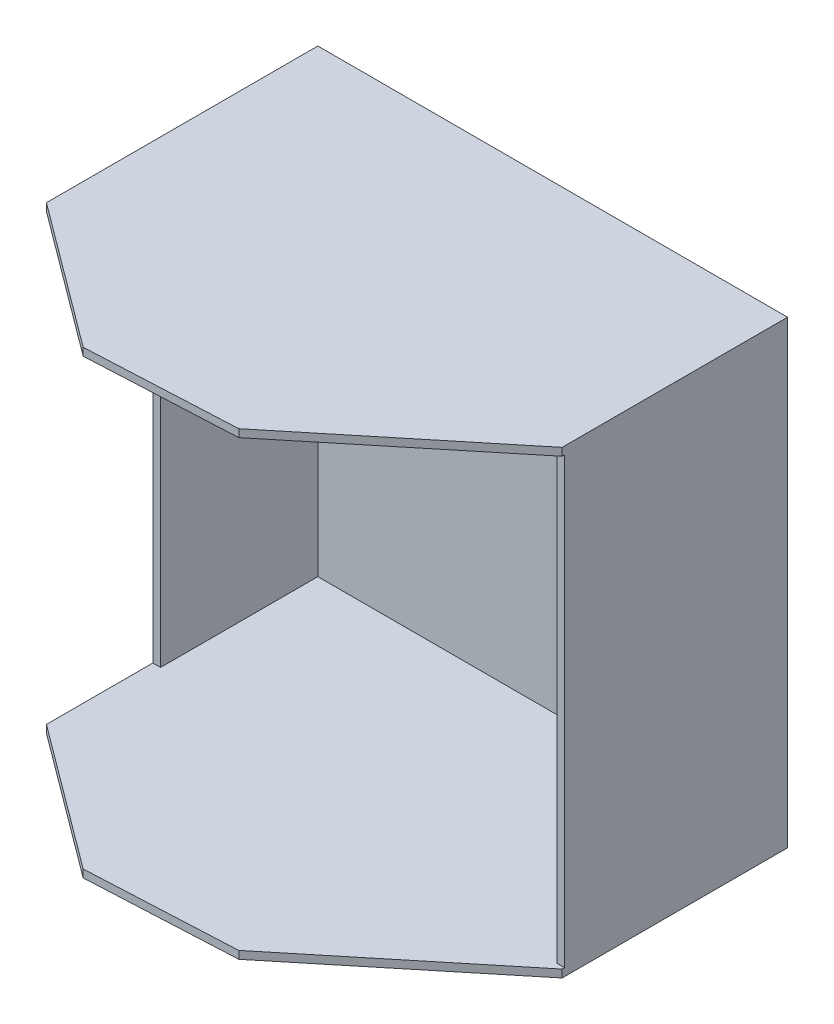
ISO-10303-21;
HEADER;
FILE_DESCRIPTION(('STEP AP214'),'2;1');
FILE_NAME('part.step','',(''),(''),'','','');
FILE_SCHEMA(('AUTOMOTIVE_DESIGN { 1 0 10303 214 1 1 1 1 }'));
ENDSEC;
DATA;
#1=APPLICATION_CONTEXT('core data for automotive mechanical design processes');
#2=APPLICATION_PROTOCOL_DEFINITION('international standard','automotive_design',2000,#1);
#3=PRODUCT_CONTEXT('',#1,'mechanical');
#4=PRODUCT('Part','Part','',(#3));
#5=PRODUCT_RELATED_PRODUCT_CATEGORY('part','',(#4));
#6=PRODUCT_DEFINITION_FORMATION('','',#4);
#7=PRODUCT_DEFINITION_CONTEXT('part definition',#1,'design');
#8=PRODUCT_DEFINITION('design','',#6,#7);
#9=PRODUCT_DEFINITION_SHAPE('','',#8);
#10=(LENGTH_UNIT() NAMED_UNIT(*) SI_UNIT(.MILLI.,.METRE.));
#11=(NAMED_UNIT(*) PLANE_ANGLE_UNIT() SI_UNIT($,.RADIAN.));
#12=(NAMED_UNIT(*) SI_UNIT($,.STERADIAN.) SOLID_ANGLE_UNIT());
#13=UNCERTAINTY_MEASURE_WITH_UNIT(LENGTH_MEASURE(1.E-05),#10,'distance_accuracy_value','');
#14=(GEOMETRIC_REPRESENTATION_CONTEXT(3) GLOBAL_UNCERTAINTY_ASSIGNED_CONTEXT((#13)) GLOBAL_UNIT_ASSIGNED_CONTEXT((#10,
#11,#12)) REPRESENTATION_CONTEXT('',''));
#15=CARTESIAN_POINT('',(0.,0.,0.));
#16=DIRECTION('',(0.,0.,1.));
#17=DIRECTION('',(1.,0.,0.));
#18=AXIS2_PLACEMENT_3D('',#15,#16,#17);
#19=CARTESIAN_POINT('',(-71.1992979722016,190.,65.));
#20=DIRECTION('',(0.,0.,-1.));
#21=DIRECTION('',(-1.,0.,0.));
#22=AXIS2_PLACEMENT_3D('',#19,#20,#21);
#23=PLANE('',#22);
#24=DIRECTION('',(-1.,0.,0.));
#25=VECTOR('',#24,1.);
#26=CARTESIAN_POINT('',(-74.3992979722016,186.8,65.));
#27=LINE('',#26,#25);
#28=CARTESIAN_POINT('',(-71.1992979722016,186.8,65.));
#29=VERTEX_POINT('',#28);
#30=CARTESIAN_POINT('',(-74.3992979722016,186.8,65.));
#31=VERTEX_POINT('',#30);
#32=EDGE_CURVE('E226',#29,#31,#27,.T.);
#33=ORIENTED_EDGE('',*,*,#32,.T.);
#34=DIRECTION('',(0.,-1.,0.));
#35=VECTOR('',#34,1.);
#36=CARTESIAN_POINT('',(-74.3992979722016,190.,65.));
#37=LINE('',#36,#35);
#38=CARTESIAN_POINT('',(-74.3992979722016,3.2,65.));
#39=VERTEX_POINT('',#38);
#40=EDGE_CURVE('E269',#31,#39,#37,.T.);
#41=ORIENTED_EDGE('',*,*,#40,.T.);
#42=DIRECTION('',(-1.,0.,0.));
#43=VECTOR('',#42,1.);
#44=CARTESIAN_POINT('',(-74.3992979722016,3.2,65.));
#45=LINE('',#44,#43);
#46=CARTESIAN_POINT('',(-71.1992979722016,3.2,65.));
#47=VERTEX_POINT('',#46);
#48=EDGE_CURVE('E164',#47,#39,#45,.T.);
#49=ORIENTED_EDGE('',*,*,#48,.F.);
#50=DIRECTION('',(0.,-1.,0.));
#51=VECTOR('',#50,1.);
#52=CARTESIAN_POINT('',(-71.1992979722016,190.,65.));
#53=LINE('',#52,#51);
#54=EDGE_CURVE('E89',#29,#47,#53,.T.);
#55=ORIENTED_EDGE('',*,*,#54,.F.);
#56=EDGE_LOOP('',(#33,#41,#49,#55));
#57=FACE_BOUND('',#56,.T.);
#58=ADVANCED_FACE('F33',(#57),#23,.F.);
#59=CARTESIAN_POINT('',(-71.1992979722016,190.,0.));
#60=DIRECTION('',(-1.,0.,0.));
#61=DIRECTION('',(0.,0.,1.));
#62=AXIS2_PLACEMENT_3D('',#59,#60,#61);
#63=PLANE('',#62);
#64=DIRECTION('',(0.,0.,1.));
#65=VECTOR('',#64,1.);
#66=CARTESIAN_POINT('',(-71.1992979722016,186.8,65.));
#67=LINE('',#66,#65);
#68=CARTESIAN_POINT('',(-71.1992979722016,186.8,0.));
#69=VERTEX_POINT('',#68);
#70=EDGE_CURVE('E206',#69,#29,#67,.T.);
#71=ORIENTED_EDGE('',*,*,#70,.T.);
#72=ORIENTED_EDGE('',*,*,#54,.T.);
#73=DIRECTION('',(0.,0.,1.));
#74=VECTOR('',#73,1.);
#75=CARTESIAN_POINT('',(-71.1992979722016,3.2,65.));
#76=LINE('',#75,#74);
#77=CARTESIAN_POINT('',(-71.1992979722016,3.2,0.));
#78=VERTEX_POINT('',#77);
#79=EDGE_CURVE('E143',#78,#47,#76,.T.);
#80=ORIENTED_EDGE('',*,*,#79,.F.);
#81=DIRECTION('',(0.,-1.,0.));
#82=VECTOR('',#81,1.);
#83=CARTESIAN_POINT('',(-71.1992979722016,190.,0.));
#84=LINE('',#83,#82);
#85=EDGE_CURVE('E57',#69,#78,#84,.T.);
#86=ORIENTED_EDGE('',*,*,#85,.F.);
#87=EDGE_LOOP('',(#71,#72,#80,#86));
#88=FACE_BOUND('',#87,.T.);
#89=ADVANCED_FACE('F290',(#88),#63,.F.);
#90=CARTESIAN_POINT('',(116.600702027798,190.,0.));
#91=DIRECTION('',(1.,0.,0.));
#92=DIRECTION('',(0.,0.,-1.));
#93=AXIS2_PLACEMENT_3D('',#90,#91,#92);
#94=PLANE('',#93);
#95=DIRECTION('',(0.,0.,1.));
#96=VECTOR('',#95,1.);
#97=CARTESIAN_POINT('',(116.600702027798,186.8,0.));
#98=LINE('',#97,#96);
#99=CARTESIAN_POINT('',(116.600702027798,186.8,0.));
#100=VERTEX_POINT('',#99);
#101=CARTESIAN_POINT('',(116.600702027798,186.8,89.));
#102=VERTEX_POINT('',#101);
#103=EDGE_CURVE('E248',#100,#102,#98,.T.);
#104=ORIENTED_EDGE('',*,*,#103,.F.);
#105=DIRECTION('',(0.,-1.,0.));
#106=VECTOR('',#105,1.);
#107=CARTESIAN_POINT('',(116.600702027798,190.,0.));
#108=LINE('',#107,#106);
#109=CARTESIAN_POINT('',(116.600702027798,3.2,0.));
#110=VERTEX_POINT('',#109);
#111=EDGE_CURVE('E258',#100,#110,#108,.T.);
#112=ORIENTED_EDGE('',*,*,#111,.T.);
#113=DIRECTION('',(0.,0.,1.));
#114=VECTOR('',#113,1.);
#115=CARTESIAN_POINT('',(116.600702027798,3.2,0.));
#116=LINE('',#115,#114);
#117=CARTESIAN_POINT('',(116.600702027798,3.2,89.));
#118=VERTEX_POINT('',#117);
#119=EDGE_CURVE('E263',#110,#118,#116,.T.);
#120=ORIENTED_EDGE('',*,*,#119,.T.);
#121=DIRECTION('',(0.,-1.,0.));
#122=VECTOR('',#121,1.);
#123=CARTESIAN_POINT('',(116.600702027798,190.,89.));
#124=LINE('',#123,#122);
#125=EDGE_CURVE('E48',#102,#118,#124,.T.);
#126=ORIENTED_EDGE('',*,*,#125,.F.);
#127=EDGE_LOOP('',(#104,#112,#120,#126));
#128=FACE_BOUND('',#127,.T.);
#129=ADVANCED_FACE('F297',(#128),#94,.F.);
#130=CARTESIAN_POINT('',(116.600702027798,190.,89.));
#131=DIRECTION('',(0.,0.,-1.));
#132=DIRECTION('',(-1.,0.,0.));
#133=AXIS2_PLACEMENT_3D('',#130,#131,#132);
#134=PLANE('',#133);
#135=DIRECTION('',(1.,0.,0.));
#136=VECTOR('',#135,1.);
#137=CARTESIAN_POINT('',(116.600702027798,186.8,89.));
#138=LINE('',#137,#136);
#139=CARTESIAN_POINT('',(119.800702027798,186.8,89.));
#140=VERTEX_POINT('',#139);
#141=EDGE_CURVE('E11',#102,#140,#138,.T.);
#142=ORIENTED_EDGE('',*,*,#141,.F.);
#143=ORIENTED_EDGE('',*,*,#125,.T.);
#144=DIRECTION('',(1.,0.,0.));
#145=VECTOR('',#144,1.);
#146=CARTESIAN_POINT('',(0.,3.2,89.));
#147=LINE('',#146,#145);
#148=CARTESIAN_POINT('',(119.800702027798,3.20000000000001,89.));
#149=VERTEX_POINT('',#148);
#150=EDGE_CURVE('E261',#118,#149,#147,.T.);
#151=ORIENTED_EDGE('',*,*,#150,.T.);
#152=DIRECTION('',(0.,-1.,0.));
#153=VECTOR('',#152,1.);
#154=CARTESIAN_POINT('',(119.800702027798,190.,89.));
#155=LINE('',#154,#153);
#156=EDGE_CURVE('E254',#140,#149,#155,.T.);
#157=ORIENTED_EDGE('',*,*,#156,.F.);
#158=EDGE_LOOP('',(#142,#143,#151,#157));
#159=FACE_BOUND('',#158,.T.);
#160=ADVANCED_FACE('F306',(#159),#134,.F.);
#161=CARTESIAN_POINT('',(0.,3.2,0.));
#162=DIRECTION('',(0.,-1.,0.));
#163=DIRECTION('',(0.,0.,-1.));
#164=AXIS2_PLACEMENT_3D('',#161,#162,#163);
#165=PLANE('',#164);
#166=ORIENTED_EDGE('',*,*,#119,.F.);
#167=DIRECTION('',(-1.,0.,0.));
#168=VECTOR('',#167,1.);
#169=CARTESIAN_POINT('',(-71.1992979722016,3.2,0.));
#170=LINE('',#169,#168);
#171=EDGE_CURVE('E128',#110,#78,#170,.T.);
#172=ORIENTED_EDGE('',*,*,#171,.T.);
#173=ORIENTED_EDGE('',*,*,#79,.T.);
#174=ORIENTED_EDGE('',*,*,#48,.T.);
#175=DIRECTION('',(0.,0.,1.));
#176=VECTOR('',#175,1.);
#177=CARTESIAN_POINT('',(-74.3992979722016,3.2,109.));
#178=LINE('',#177,#176);
#179=CARTESIAN_POINT('',(-74.3992979722016,3.2,109.));
#180=VERTEX_POINT('',#179);
#181=EDGE_CURVE('E167',#39,#180,#178,.T.);
#182=ORIENTED_EDGE('',*,*,#181,.T.);
#183=DIRECTION('',(0.802210362931271,0.,0.597041483990583));
#184=VECTOR('',#183,1.);
#185=CARTESIAN_POINT('',(-15.0357311152875,3.2,153.181069815303));
#186=LINE('',#185,#184);
#187=CARTESIAN_POINT('',(-15.0357311152875,3.2,153.181069815303));
#188=VERTEX_POINT('',#187);
#189=EDGE_CURVE('E112',#180,#188,#186,.T.);
#190=ORIENTED_EDGE('',*,*,#189,.T.);
#191=DIRECTION('',(0.998784397084784,0.,-0.0492922726193887));
#192=VECTOR('',#191,1.);
#193=CARTESIAN_POINT('',(46.2729248544923,3.2,150.155348755972));
#194=LINE('',#193,#192);
#195=CARTESIAN_POINT('',(46.2729248544923,3.2,150.155348755972));
#196=VERTEX_POINT('',#195);
#197=EDGE_CURVE('E104',#188,#196,#194,.T.);
#198=ORIENTED_EDGE('',*,*,#197,.T.);
#199=DIRECTION('',(0.773976601824276,0.,-0.633214197431285));
#200=VECTOR('',#199,1.);
#201=CARTESIAN_POINT('',(119.800702027798,3.2,90.));
#202=LINE('',#201,#200);
#203=CARTESIAN_POINT('',(119.800702027798,3.2,90.));
#204=VERTEX_POINT('',#203);
#205=EDGE_CURVE('E110',#196,#204,#202,.T.);
#206=ORIENTED_EDGE('',*,*,#205,.T.);
#207=DIRECTION('',(0.,0.,-1.));
#208=VECTOR('',#207,1.);
#209=CARTESIAN_POINT('',(119.800702027798,3.2,0.));
#210=LINE('',#209,#208);
#211=EDGE_CURVE('E126',#204,#149,#210,.T.);
#212=ORIENTED_EDGE('',*,*,#211,.T.);
#213=ORIENTED_EDGE('',*,*,#150,.F.);
#214=EDGE_LOOP('',(#166,#172,#173,#174,#182,#190,#198,#206,#212,#213));
#215=FACE_BOUND('',#214,.T.);
#216=ADVANCED_FACE('F107',(#215),#165,.F.);
#217=CARTESIAN_POINT('',(-74.3992979722016,3.2,109.));
#218=DIRECTION('',(1.,0.,0.));
#219=DIRECTION('',(0.,0.,-1.));
#220=AXIS2_PLACEMENT_3D('',#217,#218,#219);
#221=PLANE('',#220);
#222=DIRECTION('',(0.,0.,1.));
#223=VECTOR('',#222,1.);
#224=CARTESIAN_POINT('',(-74.3992979722016,0.,109.));
#225=LINE('',#224,#223);
#226=CARTESIAN_POINT('',(-74.3992979722016,0.,-3.2));
#227=VERTEX_POINT('',#226);
#228=CARTESIAN_POINT('',(-74.3992979722016,0.,109.));
#229=VERTEX_POINT('',#228);
#230=EDGE_CURVE('E133',#227,#229,#225,.T.);
#231=ORIENTED_EDGE('',*,*,#230,.T.);
#232=DIRECTION('',(0.,-1.,0.));
#233=VECTOR('',#232,1.);
#234=CARTESIAN_POINT('',(-74.3992979722016,3.2,109.));
#235=LINE('',#234,#233);
#236=EDGE_CURVE('E145',#180,#229,#235,.T.);
#237=ORIENTED_EDGE('',*,*,#236,.F.);
#238=ORIENTED_EDGE('',*,*,#181,.F.);
#239=ORIENTED_EDGE('',*,*,#40,.F.);
#240=DIRECTION('',(0.,0.,1.));
#241=VECTOR('',#240,1.);
#242=CARTESIAN_POINT('',(-74.3992979722016,186.8,109.));
#243=LINE('',#242,#241);
#244=CARTESIAN_POINT('',(-74.3992979722016,186.8,109.));
#245=VERTEX_POINT('',#244);
#246=EDGE_CURVE('E223',#31,#245,#243,.T.);
#247=ORIENTED_EDGE('',*,*,#246,.T.);
#248=DIRECTION('',(0.,1.,0.));
#249=VECTOR('',#248,1.);
#250=CARTESIAN_POINT('',(-74.3992979722016,186.8,109.));
#251=LINE('',#250,#249);
#252=CARTESIAN_POINT('',(-74.3992979722016,190.,109.));
#253=VERTEX_POINT('',#252);
#254=EDGE_CURVE('E229',#245,#253,#251,.T.);
#255=ORIENTED_EDGE('',*,*,#254,.T.);
#256=DIRECTION('',(0.,0.,1.));
#257=VECTOR('',#256,1.);
#258=CARTESIAN_POINT('',(-74.3992979722016,190.,65.));
#259=LINE('',#258,#257);
#260=CARTESIAN_POINT('',(-74.3992979722016,190.,-3.2));
#261=VERTEX_POINT('',#260);
#262=EDGE_CURVE('E266',#261,#253,#259,.T.);
#263=ORIENTED_EDGE('',*,*,#262,.F.);
#264=DIRECTION('',(0.,-1.,0.));
#265=VECTOR('',#264,1.);
#266=CARTESIAN_POINT('',(-74.3992979722016,0.,-3.2));
#267=LINE('',#266,#265);
#268=EDGE_CURVE('E200',#261,#227,#267,.T.);
#269=ORIENTED_EDGE('',*,*,#268,.T.);
#270=EDGE_LOOP('',(#231,#237,#238,#239,#247,#255,#263,#269));
#271=FACE_BOUND('',#270,.T.);
#272=ADVANCED_FACE('F35',(#271),#221,.F.);
#273=CARTESIAN_POINT('',(-15.0357311152875,3.2,153.181069815303));
#274=DIRECTION('',(0.597041483990583,0.,-0.802210362931271));
#275=DIRECTION('',(-0.802210362931272,0.,-0.597041483990583));
#276=AXIS2_PLACEMENT_3D('',#273,#274,#275);
#277=PLANE('',#276);
#278=DIRECTION('',(0.802210362931271,0.,0.597041483990583));
#279=VECTOR('',#278,1.);
#280=CARTESIAN_POINT('',(-15.0357311152875,0.,153.181069815303));
#281=LINE('',#280,#279);
#282=CARTESIAN_POINT('',(-15.0357311152875,0.,153.181069815303));
#283=VERTEX_POINT('',#282);
#284=EDGE_CURVE('E135',#229,#283,#281,.T.);
#285=ORIENTED_EDGE('',*,*,#284,.T.);
#286=DIRECTION('',(0.,-1.,0.));
#287=VECTOR('',#286,1.);
#288=CARTESIAN_POINT('',(-15.0357311152875,3.2,153.181069815303));
#289=LINE('',#288,#287);
#290=EDGE_CURVE('E121',#188,#283,#289,.T.);
#291=ORIENTED_EDGE('',*,*,#290,.F.);
#292=ORIENTED_EDGE('',*,*,#189,.F.);
#293=ORIENTED_EDGE('',*,*,#236,.T.);
#294=EDGE_LOOP('',(#285,#291,#292,#293));
#295=FACE_BOUND('',#294,.T.);
#296=ADVANCED_FACE('F174',(#295),#277,.F.);
#297=CARTESIAN_POINT('',(46.2729248544923,3.2,150.155348755972));
#298=DIRECTION('',(-0.0492922726193887,0.,-0.998784397084784));
#299=DIRECTION('',(-0.998784397084784,0.,0.0492922726193887));
#300=AXIS2_PLACEMENT_3D('',#297,#298,#299);
#301=PLANE('',#300);
#302=DIRECTION('',(0.998784397084784,0.,-0.0492922726193887));
#303=VECTOR('',#302,1.);
#304=CARTESIAN_POINT('',(46.2729248544923,0.,150.155348755972));
#305=LINE('',#304,#303);
#306=CARTESIAN_POINT('',(46.2729248544923,0.,150.155348755972));
#307=VERTEX_POINT('',#306);
#308=EDGE_CURVE('E120',#283,#307,#305,.T.);
#309=ORIENTED_EDGE('',*,*,#308,.T.);
#310=DIRECTION('',(0.,-1.,0.));
#311=VECTOR('',#310,1.);
#312=CARTESIAN_POINT('',(46.2729248544923,3.2,150.155348755972));
#313=LINE('',#312,#311);
#314=EDGE_CURVE('E117',#196,#307,#313,.T.);
#315=ORIENTED_EDGE('',*,*,#314,.F.);
#316=ORIENTED_EDGE('',*,*,#197,.F.);
#317=ORIENTED_EDGE('',*,*,#290,.T.);
#318=EDGE_LOOP('',(#309,#315,#316,#317));
#319=FACE_BOUND('',#318,.T.);
#320=ADVANCED_FACE('F118',(#319),#301,.F.);
#321=CARTESIAN_POINT('',(119.800702027798,3.2,90.));
#322=DIRECTION('',(-0.633214197431285,0.,-0.773976601824276));
#323=DIRECTION('',(-0.773976601824276,0.,0.633214197431285));
#324=AXIS2_PLACEMENT_3D('',#321,#322,#323);
#325=PLANE('',#324);
#326=DIRECTION('',(0.773976601824276,0.,-0.633214197431285));
#327=VECTOR('',#326,1.);
#328=CARTESIAN_POINT('',(119.800702027798,0.,90.));
#329=LINE('',#328,#327);
#330=CARTESIAN_POINT('',(119.800702027798,0.,90.));
#331=VERTEX_POINT('',#330);
#332=EDGE_CURVE('E80',#307,#331,#329,.T.);
#333=ORIENTED_EDGE('',*,*,#332,.T.);
#334=DIRECTION('',(0.,-1.,0.));
#335=VECTOR('',#334,1.);
#336=CARTESIAN_POINT('',(119.800702027798,3.2,90.));
#337=LINE('',#336,#335);
#338=EDGE_CURVE('E122',#204,#331,#337,.T.);
#339=ORIENTED_EDGE('',*,*,#338,.F.);
#340=ORIENTED_EDGE('',*,*,#205,.F.);
#341=ORIENTED_EDGE('',*,*,#314,.T.);
#342=EDGE_LOOP('',(#333,#339,#340,#341));
#343=FACE_BOUND('',#342,.T.);
#344=ADVANCED_FACE('F124',(#343),#325,.F.);
#345=CARTESIAN_POINT('',(119.800702027798,3.2,0.));
#346=DIRECTION('',(-1.,0.,0.));
#347=DIRECTION('',(0.,0.,1.));
#348=AXIS2_PLACEMENT_3D('',#345,#346,#347);
#349=PLANE('',#348);
#350=DIRECTION('',(0.,0.,-1.));
#351=VECTOR('',#350,1.);
#352=CARTESIAN_POINT('',(119.800702027798,190.,89.));
#353=LINE('',#352,#351);
#354=CARTESIAN_POINT('',(119.800702027798,190.,90.));
#355=VERTEX_POINT('',#354);
#356=CARTESIAN_POINT('',(119.800702027798,190.,-3.2));
#357=VERTEX_POINT('',#356);
#358=EDGE_CURVE('E251',#355,#357,#353,.T.);
#359=ORIENTED_EDGE('',*,*,#358,.F.);
#360=DIRECTION('',(0.,1.,0.));
#361=VECTOR('',#360,1.);
#362=CARTESIAN_POINT('',(119.800702027798,186.8,90.));
#363=LINE('',#362,#361);
#364=CARTESIAN_POINT('',(119.800702027798,186.8,90.));
#365=VERTEX_POINT('',#364);
#366=EDGE_CURVE('E245',#365,#355,#363,.T.);
#367=ORIENTED_EDGE('',*,*,#366,.F.);
#368=DIRECTION('',(0.,0.,-1.));
#369=VECTOR('',#368,1.);
#370=CARTESIAN_POINT('',(119.800702027798,186.8,0.));
#371=LINE('',#370,#369);
#372=EDGE_CURVE('E211',#365,#140,#371,.T.);
#373=ORIENTED_EDGE('',*,*,#372,.T.);
#374=ORIENTED_EDGE('',*,*,#156,.T.);
#375=ORIENTED_EDGE('',*,*,#211,.F.);
#376=ORIENTED_EDGE('',*,*,#338,.T.);
#377=DIRECTION('',(0.,0.,-1.));
#378=VECTOR('',#377,1.);
#379=CARTESIAN_POINT('',(119.800702027798,0.,0.));
#380=LINE('',#379,#378);
#381=CARTESIAN_POINT('',(119.800702027798,0.,-3.2));
#382=VERTEX_POINT('',#381);
#383=EDGE_CURVE('E140',#331,#382,#380,.T.);
#384=ORIENTED_EDGE('',*,*,#383,.T.);
#385=DIRECTION('',(0.,1.,0.));
#386=VECTOR('',#385,1.);
#387=CARTESIAN_POINT('',(119.800702027798,0.,-3.2));
#388=LINE('',#387,#386);
#389=EDGE_CURVE('E189',#382,#357,#388,.T.);
#390=ORIENTED_EDGE('',*,*,#389,.T.);
#391=EDGE_LOOP('',(#359,#367,#373,#374,#375,#376,#384,#390));
#392=FACE_BOUND('',#391,.T.);
#393=ADVANCED_FACE('F187',(#392),#349,.F.);
#394=CARTESIAN_POINT('',(0.,0.,0.));
#395=DIRECTION('',(0.,-1.,0.));
#396=DIRECTION('',(0.,0.,-1.));
#397=AXIS2_PLACEMENT_3D('',#394,#395,#396);
#398=PLANE('',#397);
#399=ORIENTED_EDGE('',*,*,#230,.F.);
#400=DIRECTION('',(1.,0.,0.));
#401=VECTOR('',#400,1.);
#402=CARTESIAN_POINT('',(-74.3992979722016,0.,-3.2));
#403=LINE('',#402,#401);
#404=EDGE_CURVE('E182',#227,#382,#403,.T.);
#405=ORIENTED_EDGE('',*,*,#404,.T.);
#406=ORIENTED_EDGE('',*,*,#383,.F.);
#407=ORIENTED_EDGE('',*,*,#332,.F.);
#408=ORIENTED_EDGE('',*,*,#308,.F.);
#409=ORIENTED_EDGE('',*,*,#284,.F.);
#410=EDGE_LOOP('',(#399,#405,#406,#407,#408,#409));
#411=FACE_BOUND('',#410,.T.);
#412=CARTESIAN_POINT('',(-5.39929797220156,0.,108.199281836625));
#413=DIRECTION('',(0.,-1.,0.));
#414=DIRECTION('',(0.,0.,-1.));
#415=AXIS2_PLACEMENT_3D('',#412,#413,#414);
#416=CIRCLE('',#415,12.3);
#417=CARTESIAN_POINT('',(-5.39929797220156,0.,95.8992818366245));
#418=VERTEX_POINT('',#417);
#419=EDGE_CURVE('E160',#418,#418,#416,.T.);
#420=ORIENTED_EDGE('',*,*,#419,.F.);
#421=EDGE_LOOP('',(#420));
#422=FACE_BOUND('',#421,.T.);
#423=ADVANCED_FACE('F176',(#411,#422),#398,.T.);
#424=CARTESIAN_POINT('',(-5.39929797220156,-3.2,108.199281836625));
#425=DIRECTION('',(0.,1.,0.));
#426=DIRECTION('',(0.,0.,1.));
#427=AXIS2_PLACEMENT_3D('',#424,#425,#426);
#428=CYLINDRICAL_SURFACE('',#427,12.3);
#429=CARTESIAN_POINT('',(-5.39929797220156,-3.2,108.199281836625));
#430=DIRECTION('',(0.,-1.,0.));
#431=DIRECTION('',(0.,0.,-1.));
#432=AXIS2_PLACEMENT_3D('',#429,#430,#431);
#433=CIRCLE('',#432,12.3);
#434=CARTESIAN_POINT('',(-5.39929797220156,-3.2,95.8992818366245));
#435=VERTEX_POINT('',#434);
#436=EDGE_CURVE('E136',#435,#435,#433,.T.);
#437=ORIENTED_EDGE('',*,*,#436,.F.);
#438=EDGE_LOOP('',(#437));
#439=FACE_BOUND('',#438,.T.);
#440=ORIENTED_EDGE('',*,*,#419,.T.);
#441=EDGE_LOOP('',(#440));
#442=FACE_BOUND('',#441,.T.);
#443=ADVANCED_FACE('F286',(#439,#442),#428,.T.);
#444=CARTESIAN_POINT('',(-5.39929797220156,-3.2,108.199281836625));
#445=DIRECTION('',(0.,-1.,0.));
#446=DIRECTION('',(0.,0.,-1.));
#447=AXIS2_PLACEMENT_3D('',#444,#445,#446);
#448=PLANE('',#447);
#449=CARTESIAN_POINT('',(-5.39929797220156,-3.2,108.199281836625));
#450=DIRECTION('',(0.,-1.,0.));
#451=DIRECTION('',(0.,0.,-1.));
#452=AXIS2_PLACEMENT_3D('',#449,#450,#451);
#453=CIRCLE('',#452,4.);
#454=CARTESIAN_POINT('',(-5.39929797220156,-3.2,104.199281836625));
#455=VERTEX_POINT('',#454);
#456=EDGE_CURVE('E41',#455,#455,#453,.T.);
#457=ORIENTED_EDGE('',*,*,#456,.F.);
#458=EDGE_LOOP('',(#457));
#459=FACE_BOUND('',#458,.T.);
#460=ORIENTED_EDGE('',*,*,#436,.T.);
#461=EDGE_LOOP('',(#460));
#462=FACE_BOUND('',#461,.T.);
#463=ADVANCED_FACE('F278',(#459,#462),#448,.T.);
#464=CARTESIAN_POINT('',(-5.39929797220156,-7.2,108.199281836625));
#465=DIRECTION('',(0.,1.,0.));
#466=DIRECTION('',(0.,0.,1.));
#467=AXIS2_PLACEMENT_3D('',#464,#465,#466);
#468=CYLINDRICAL_SURFACE('',#467,4.);
#469=CARTESIAN_POINT('',(-5.39929797220156,-7.2,108.199281836625));
#470=DIRECTION('',(0.,-1.,0.));
#471=DIRECTION('',(0.,0.,-1.));
#472=AXIS2_PLACEMENT_3D('',#469,#470,#471);
#473=CIRCLE('',#472,4.);
#474=CARTESIAN_POINT('',(-5.39929797220156,-7.2,104.199281836625));
#475=VERTEX_POINT('',#474);
#476=EDGE_CURVE('E156',#475,#475,#473,.T.);
#477=ORIENTED_EDGE('',*,*,#476,.F.);
#478=EDGE_LOOP('',(#477));
#479=FACE_BOUND('',#478,.T.);
#480=ORIENTED_EDGE('',*,*,#456,.T.);
#481=EDGE_LOOP('',(#480));
#482=FACE_BOUND('',#481,.T.);
#483=ADVANCED_FACE('F276',(#479,#482),#468,.T.);
#484=CARTESIAN_POINT('',(-5.39929797220156,-7.2,108.199281836625));
#485=DIRECTION('',(0.,-1.,0.));
#486=DIRECTION('',(0.,0.,-1.));
#487=AXIS2_PLACEMENT_3D('',#484,#485,#486);
#488=PLANE('',#487);
#489=ORIENTED_EDGE('',*,*,#476,.T.);
#490=EDGE_LOOP('',(#489));
#491=FACE_BOUND('',#490,.T.);
#492=ADVANCED_FACE('F274',(#491),#488,.T.);
#493=CARTESIAN_POINT('',(0.,190.,0.));
#494=DIRECTION('',(0.,-1.,0.));
#495=DIRECTION('',(0.,0.,-1.));
#496=AXIS2_PLACEMENT_3D('',#493,#494,#495);
#497=PLANE('',#496);
#498=ORIENTED_EDGE('',*,*,#358,.T.);
#499=DIRECTION('',(-1.,0.,0.));
#500=VECTOR('',#499,1.);
#501=CARTESIAN_POINT('',(-74.3992979722016,190.,-3.2));
#502=LINE('',#501,#500);
#503=EDGE_CURVE('E198',#357,#261,#502,.T.);
#504=ORIENTED_EDGE('',*,*,#503,.T.);
#505=ORIENTED_EDGE('',*,*,#262,.T.);
#506=DIRECTION('',(0.802210362931271,0.,0.597041483990583));
#507=VECTOR('',#506,1.);
#508=CARTESIAN_POINT('',(-15.0357311152875,190.,153.181069815303));
#509=LINE('',#508,#507);
#510=CARTESIAN_POINT('',(-15.0357311152875,190.,153.181069815303));
#511=VERTEX_POINT('',#510);
#512=EDGE_CURVE('E209',#253,#511,#509,.T.);
#513=ORIENTED_EDGE('',*,*,#512,.T.);
#514=DIRECTION('',(0.998784397084784,0.,-0.0492922726193887));
#515=VECTOR('',#514,1.);
#516=CARTESIAN_POINT('',(46.2729248544923,190.,150.155348755972));
#517=LINE('',#516,#515);
#518=CARTESIAN_POINT('',(46.2729248544923,190.,150.155348755972));
#519=VERTEX_POINT('',#518);
#520=EDGE_CURVE('E232',#511,#519,#517,.T.);
#521=ORIENTED_EDGE('',*,*,#520,.T.);
#522=DIRECTION('',(0.773976601824276,0.,-0.633214197431285));
#523=VECTOR('',#522,1.);
#524=CARTESIAN_POINT('',(119.800702027798,190.,90.));
#525=LINE('',#524,#523);
#526=EDGE_CURVE('E205',#519,#355,#525,.T.);
#527=ORIENTED_EDGE('',*,*,#526,.T.);
#528=EDGE_LOOP('',(#498,#504,#505,#513,#521,#527));
#529=FACE_BOUND('',#528,.T.);
#530=ADVANCED_FACE('F284',(#529),#497,.F.);
#531=CARTESIAN_POINT('',(0.,186.8,0.));
#532=DIRECTION('',(0.,1.,0.));
#533=DIRECTION('',(0.,0.,-1.));
#534=AXIS2_PLACEMENT_3D('',#531,#532,#533);
#535=PLANE('',#534);
#536=DIRECTION('',(-1.,0.,0.));
#537=VECTOR('',#536,1.);
#538=CARTESIAN_POINT('',(-71.1992979722016,186.8,0.));
#539=LINE('',#538,#537);
#540=EDGE_CURVE('E208',#100,#69,#539,.T.);
#541=ORIENTED_EDGE('',*,*,#540,.F.);
#542=ORIENTED_EDGE('',*,*,#103,.T.);
#543=ORIENTED_EDGE('',*,*,#141,.T.);
#544=ORIENTED_EDGE('',*,*,#372,.F.);
#545=DIRECTION('',(0.773976601824276,0.,-0.633214197431285));
#546=VECTOR('',#545,1.);
#547=CARTESIAN_POINT('',(119.800702027798,186.8,90.));
#548=LINE('',#547,#546);
#549=CARTESIAN_POINT('',(46.2729248544923,186.8,150.155348755972));
#550=VERTEX_POINT('',#549);
#551=EDGE_CURVE('E214',#550,#365,#548,.T.);
#552=ORIENTED_EDGE('',*,*,#551,.F.);
#553=DIRECTION('',(0.998784397084784,0.,-0.0492922726193887));
#554=VECTOR('',#553,1.);
#555=CARTESIAN_POINT('',(46.2729248544923,186.8,150.155348755972));
#556=LINE('',#555,#554);
#557=CARTESIAN_POINT('',(-15.0357311152875,186.8,153.181069815303));
#558=VERTEX_POINT('',#557);
#559=EDGE_CURVE('E217',#558,#550,#556,.T.);
#560=ORIENTED_EDGE('',*,*,#559,.F.);
#561=DIRECTION('',(0.802210362931271,0.,0.597041483990583));
#562=VECTOR('',#561,1.);
#563=CARTESIAN_POINT('',(-15.0357311152875,186.8,153.181069815303));
#564=LINE('',#563,#562);
#565=EDGE_CURVE('E220',#245,#558,#564,.T.);
#566=ORIENTED_EDGE('',*,*,#565,.F.);
#567=ORIENTED_EDGE('',*,*,#246,.F.);
#568=ORIENTED_EDGE('',*,*,#32,.F.);
#569=ORIENTED_EDGE('',*,*,#70,.F.);
#570=EDGE_LOOP('',(#541,#542,#543,#544,#552,#560,#566,#567,#568,#569));
#571=FACE_BOUND('',#570,.T.);
#572=ADVANCED_FACE('F302',(#571),#535,.F.);
#573=CARTESIAN_POINT('',(119.800702027798,186.8,90.));
#574=DIRECTION('',(0.633214197431285,0.,0.773976601824276));
#575=DIRECTION('',(0.773976601824276,0.,-0.633214197431285));
#576=AXIS2_PLACEMENT_3D('',#573,#574,#575);
#577=PLANE('',#576);
#578=ORIENTED_EDGE('',*,*,#526,.F.);
#579=DIRECTION('',(0.,1.,0.));
#580=VECTOR('',#579,1.);
#581=CARTESIAN_POINT('',(46.2729248544923,186.8,150.155348755972));
#582=LINE('',#581,#580);
#583=EDGE_CURVE('E242',#550,#519,#582,.T.);
#584=ORIENTED_EDGE('',*,*,#583,.F.);
#585=ORIENTED_EDGE('',*,*,#551,.T.);
#586=ORIENTED_EDGE('',*,*,#366,.T.);
#587=EDGE_LOOP('',(#578,#584,#585,#586));
#588=FACE_BOUND('',#587,.T.);
#589=ADVANCED_FACE('F310',(#588),#577,.T.);
#590=CARTESIAN_POINT('',(46.2729248544923,186.8,150.155348755972));
#591=DIRECTION('',(0.0492922726193887,0.,0.998784397084784));
#592=DIRECTION('',(0.998784397084784,0.,-0.0492922726193887));
#593=AXIS2_PLACEMENT_3D('',#590,#591,#592);
#594=PLANE('',#593);
#595=ORIENTED_EDGE('',*,*,#520,.F.);
#596=DIRECTION('',(0.,1.,0.));
#597=VECTOR('',#596,1.);
#598=CARTESIAN_POINT('',(-15.0357311152875,186.8,153.181069815303));
#599=LINE('',#598,#597);
#600=EDGE_CURVE('E239',#558,#511,#599,.T.);
#601=ORIENTED_EDGE('',*,*,#600,.F.);
#602=ORIENTED_EDGE('',*,*,#559,.T.);
#603=ORIENTED_EDGE('',*,*,#583,.T.);
#604=EDGE_LOOP('',(#595,#601,#602,#603));
#605=FACE_BOUND('',#604,.T.);
#606=ADVANCED_FACE('F313',(#605),#594,.T.);
#607=CARTESIAN_POINT('',(-15.0357311152875,186.8,153.181069815303));
#608=DIRECTION('',(-0.597041483990583,0.,0.802210362931271));
#609=DIRECTION('',(0.802210362931272,0.,0.597041483990583));
#610=AXIS2_PLACEMENT_3D('',#607,#608,#609);
#611=PLANE('',#610);
#612=ORIENTED_EDGE('',*,*,#512,.F.);
#613=ORIENTED_EDGE('',*,*,#254,.F.);
#614=ORIENTED_EDGE('',*,*,#565,.T.);
#615=ORIENTED_EDGE('',*,*,#600,.T.);
#616=EDGE_LOOP('',(#612,#613,#614,#615));
#617=FACE_BOUND('',#616,.T.);
#618=ADVANCED_FACE('F317',(#617),#611,.T.);
#619=CARTESIAN_POINT('',(0.,0.,0.));
#620=DIRECTION('',(0.,0.,-1.));
#621=DIRECTION('',(-1.,0.,0.));
#622=AXIS2_PLACEMENT_3D('',#619,#620,#621);
#623=PLANE('',#622);
#624=ORIENTED_EDGE('',*,*,#111,.F.);
#625=ORIENTED_EDGE('',*,*,#540,.T.);
#626=ORIENTED_EDGE('',*,*,#85,.T.);
#627=ORIENTED_EDGE('',*,*,#171,.F.);
#628=EDGE_LOOP('',(#624,#625,#626,#627));
#629=FACE_BOUND('',#628,.T.);
#630=ADVANCED_FACE('F321',(#629),#623,.F.);
#631=CARTESIAN_POINT('',(0.,0.,-3.2));
#632=DIRECTION('',(0.,0.,-1.));
#633=DIRECTION('',(-1.,0.,0.));
#634=AXIS2_PLACEMENT_3D('',#631,#632,#633);
#635=PLANE('',#634);
#636=ORIENTED_EDGE('',*,*,#389,.F.);
#637=ORIENTED_EDGE('',*,*,#404,.F.);
#638=ORIENTED_EDGE('',*,*,#268,.F.);
#639=ORIENTED_EDGE('',*,*,#503,.F.);
#640=EDGE_LOOP('',(#636,#637,#638,#639));
#641=FACE_BOUND('',#640,.T.);
#642=ADVANCED_FACE('F195',(#641),#635,.T.);
#643=CLOSED_SHELL('',(#58,#89,#129,#160,#216,#272,#296,#320,#344,#393,#423,#443,#463,#483,#492,
#530,#572,#589,#606,#618,#630,#642));
#644=MANIFOLD_SOLID_BREP('B2',#643);
#645=ADVANCED_BREP_SHAPE_REPRESENTATION('',(#18,#644),#14);
#646=SHAPE_DEFINITION_REPRESENTATION(#9,#645);
ENDSEC;
END-ISO-10303-21;
